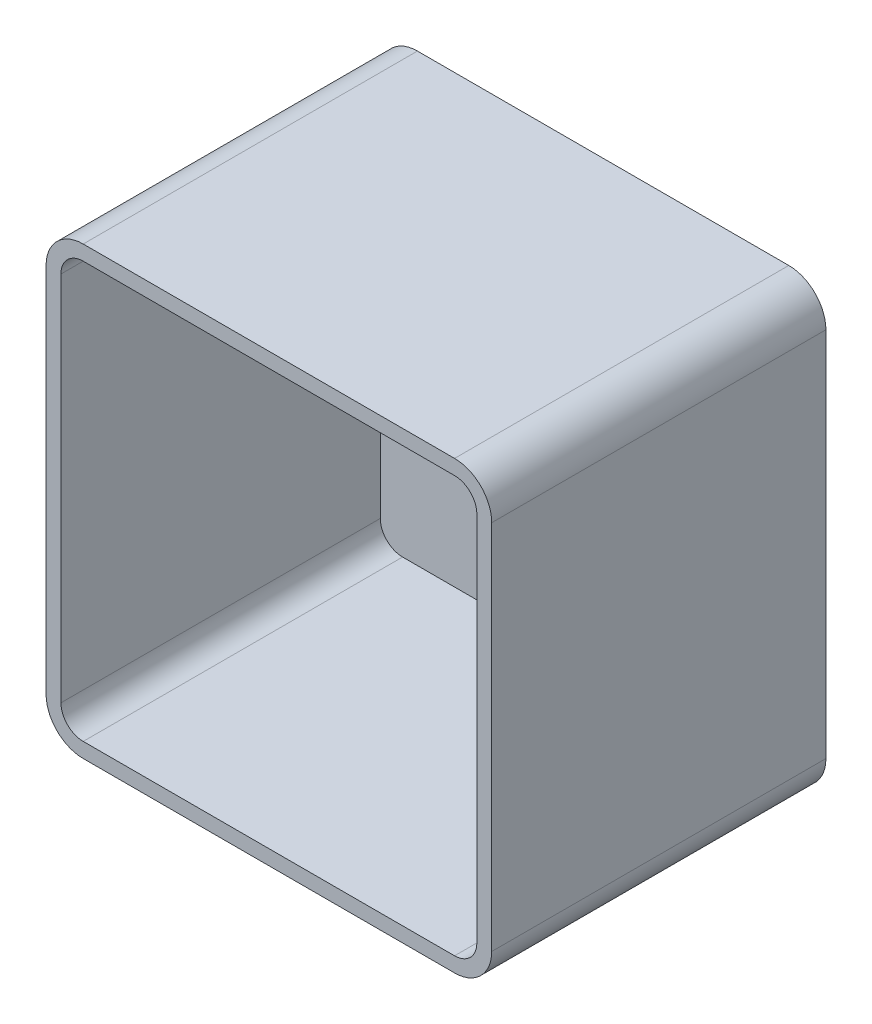
ISO-10303-21;
HEADER;
FILE_DESCRIPTION(('STEP AP214'),'2;1');
FILE_NAME('part.step','',(''),(''),'','','');
FILE_SCHEMA(('AUTOMOTIVE_DESIGN { 1 0 10303 214 1 1 1 1 }'));
ENDSEC;
DATA;
#1=APPLICATION_CONTEXT('core data for automotive mechanical design processes');
#2=APPLICATION_PROTOCOL_DEFINITION('international standard','automotive_design',2000,#1);
#3=PRODUCT_CONTEXT('',#1,'mechanical');
#4=PRODUCT('Part','Part','',(#3));
#5=PRODUCT_RELATED_PRODUCT_CATEGORY('part','',(#4));
#6=PRODUCT_DEFINITION_FORMATION('','',#4);
#7=PRODUCT_DEFINITION_CONTEXT('part definition',#1,'design');
#8=PRODUCT_DEFINITION('design','',#6,#7);
#9=PRODUCT_DEFINITION_SHAPE('','',#8);
#10=(LENGTH_UNIT() NAMED_UNIT(*) SI_UNIT(.MILLI.,.METRE.));
#11=(NAMED_UNIT(*) PLANE_ANGLE_UNIT() SI_UNIT($,.RADIAN.));
#12=(NAMED_UNIT(*) SI_UNIT($,.STERADIAN.) SOLID_ANGLE_UNIT());
#13=UNCERTAINTY_MEASURE_WITH_UNIT(LENGTH_MEASURE(1.E-05),#10,'distance_accuracy_value','');
#14=(GEOMETRIC_REPRESENTATION_CONTEXT(3) GLOBAL_UNCERTAINTY_ASSIGNED_CONTEXT((#13)) GLOBAL_UNIT_ASSIGNED_CONTEXT((#10,
#11,#12)) REPRESENTATION_CONTEXT('',''));
#15=CARTESIAN_POINT('',(0.,0.,0.));
#16=DIRECTION('',(0.,0.,1.));
#17=DIRECTION('',(1.,0.,0.));
#18=AXIS2_PLACEMENT_3D('',#15,#16,#17);
#19=CARTESIAN_POINT('',(-39.9037765875956,25.9718545893403,90.));
#20=DIRECTION('',(1.,0.,0.));
#21=DIRECTION('',(0.,1.,0.));
#22=AXIS2_PLACEMENT_3D('',#19,#20,#21);
#23=PLANE('',#22);
#24=DIRECTION('',(0.,-1.,0.));
#25=VECTOR('',#24,1.);
#26=CARTESIAN_POINT('',(-39.9037765875956,25.9718545893403,0.));
#27=LINE('',#26,#25);
#28=CARTESIAN_POINT('',(-39.9037765875956,15.9718545893403,0.));
#29=VERTEX_POINT('',#28);
#30=CARTESIAN_POINT('',(-39.9037765875956,-84.0281454106597,0.));
#31=VERTEX_POINT('',#30);
#32=EDGE_CURVE('E211',#29,#31,#27,.T.);
#33=ORIENTED_EDGE('',*,*,#32,.T.);
#34=DIRECTION('',(0.,0.,-1.));
#35=VECTOR('',#34,1.);
#36=CARTESIAN_POINT('',(-39.9037765875956,-84.0281454106597,90.));
#37=LINE('',#36,#35);
#38=CARTESIAN_POINT('',(-39.9037765875956,-84.0281454106597,90.));
#39=VERTEX_POINT('',#38);
#40=EDGE_CURVE('E261',#31,#39,#37,.F.);
#41=ORIENTED_EDGE('',*,*,#40,.T.);
#42=DIRECTION('',(0.,-1.,0.));
#43=VECTOR('',#42,1.);
#44=CARTESIAN_POINT('',(-39.9037765875956,25.9718545893403,90.));
#45=LINE('',#44,#43);
#46=CARTESIAN_POINT('',(-39.9037765875956,15.9718545893403,90.));
#47=VERTEX_POINT('',#46);
#48=EDGE_CURVE('E221',#47,#39,#45,.T.);
#49=ORIENTED_EDGE('',*,*,#48,.F.);
#50=DIRECTION('',(0.,0.,-1.));
#51=VECTOR('',#50,1.);
#52=CARTESIAN_POINT('',(-39.9037765875956,15.9718545893403,90.));
#53=LINE('',#52,#51);
#54=EDGE_CURVE('E256',#47,#29,#53,.T.);
#55=ORIENTED_EDGE('',*,*,#54,.T.);
#56=EDGE_LOOP('',(#33,#41,#49,#55));
#57=FACE_BOUND('',#56,.T.);
#58=ADVANCED_FACE('F39',(#57),#23,.F.);
#59=CARTESIAN_POINT('',(-39.9037765875956,-94.0281454106597,90.));
#60=DIRECTION('',(0.,1.,0.));
#61=DIRECTION('',(0.,0.,1.));
#62=AXIS2_PLACEMENT_3D('',#59,#60,#61);
#63=PLANE('',#62);
#64=DIRECTION('',(1.,0.,0.));
#65=VECTOR('',#64,1.);
#66=CARTESIAN_POINT('',(-39.9037765875956,-94.0281454106597,90.));
#67=LINE('',#66,#65);
#68=CARTESIAN_POINT('',(-29.9037765875956,-94.0281454106597,90.));
#69=VERTEX_POINT('',#68);
#70=CARTESIAN_POINT('',(70.0962234124044,-94.0281454106597,90.));
#71=VERTEX_POINT('',#70);
#72=EDGE_CURVE('E226',#69,#71,#67,.T.);
#73=ORIENTED_EDGE('',*,*,#72,.F.);
#74=DIRECTION('',(0.,0.,-1.));
#75=VECTOR('',#74,1.);
#76=CARTESIAN_POINT('',(-29.9037765875956,-94.0281454106597,90.));
#77=LINE('',#76,#75);
#78=CARTESIAN_POINT('',(-29.9037765875956,-94.0281454106597,0.));
#79=VERTEX_POINT('',#78);
#80=EDGE_CURVE('E246',#69,#79,#77,.T.);
#81=ORIENTED_EDGE('',*,*,#80,.T.);
#82=DIRECTION('',(1.,0.,0.));
#83=VECTOR('',#82,1.);
#84=CARTESIAN_POINT('',(-39.9037765875956,-94.0281454106597,0.));
#85=LINE('',#84,#83);
#86=CARTESIAN_POINT('',(70.0962234124044,-94.0281454106597,0.));
#87=VERTEX_POINT('',#86);
#88=EDGE_CURVE('E239',#79,#87,#85,.T.);
#89=ORIENTED_EDGE('',*,*,#88,.T.);
#90=DIRECTION('',(0.,0.,-1.));
#91=VECTOR('',#90,1.);
#92=CARTESIAN_POINT('',(70.0962234124044,-94.0281454106597,90.));
#93=LINE('',#92,#91);
#94=EDGE_CURVE('E237',#87,#71,#93,.F.);
#95=ORIENTED_EDGE('',*,*,#94,.T.);
#96=EDGE_LOOP('',(#73,#81,#89,#95));
#97=FACE_BOUND('',#96,.T.);
#98=ADVANCED_FACE('F304',(#97),#63,.F.);
#99=CARTESIAN_POINT('',(80.0962234124044,25.9718545893403,90.));
#100=DIRECTION('',(-1.,0.,0.));
#101=DIRECTION('',(0.,-1.,0.));
#102=AXIS2_PLACEMENT_3D('',#99,#100,#101);
#103=PLANE('',#102);
#104=DIRECTION('',(0.,1.,0.));
#105=VECTOR('',#104,1.);
#106=CARTESIAN_POINT('',(80.0962234124044,25.9718545893403,90.));
#107=LINE('',#106,#105);
#108=CARTESIAN_POINT('',(80.0962234124044,-84.0281454106597,90.));
#109=VERTEX_POINT('',#108);
#110=CARTESIAN_POINT('',(80.0962234124044,15.9718545893403,90.));
#111=VERTEX_POINT('',#110);
#112=EDGE_CURVE('E233',#109,#111,#107,.T.);
#113=ORIENTED_EDGE('',*,*,#112,.F.);
#114=DIRECTION('',(0.,0.,-1.));
#115=VECTOR('',#114,1.);
#116=CARTESIAN_POINT('',(80.0962234124044,-84.0281454106597,90.));
#117=LINE('',#116,#115);
#118=CARTESIAN_POINT('',(80.0962234124044,-84.0281454106597,0.));
#119=VERTEX_POINT('',#118);
#120=EDGE_CURVE('E272',#109,#119,#117,.T.);
#121=ORIENTED_EDGE('',*,*,#120,.T.);
#122=DIRECTION('',(0.,1.,0.));
#123=VECTOR('',#122,1.);
#124=CARTESIAN_POINT('',(80.0962234124044,25.9718545893403,0.));
#125=LINE('',#124,#123);
#126=CARTESIAN_POINT('',(80.0962234124044,15.9718545893403,0.));
#127=VERTEX_POINT('',#126);
#128=EDGE_CURVE('E241',#119,#127,#125,.T.);
#129=ORIENTED_EDGE('',*,*,#128,.T.);
#130=DIRECTION('',(0.,0.,-1.));
#131=VECTOR('',#130,1.);
#132=CARTESIAN_POINT('',(80.0962234124044,15.9718545893403,90.));
#133=LINE('',#132,#131);
#134=EDGE_CURVE('E271',#127,#111,#133,.F.);
#135=ORIENTED_EDGE('',*,*,#134,.T.);
#136=EDGE_LOOP('',(#113,#121,#129,#135));
#137=FACE_BOUND('',#136,.T.);
#138=ADVANCED_FACE('F310',(#137),#103,.F.);
#139=CARTESIAN_POINT('',(-39.9037765875956,25.9718545893403,90.));
#140=DIRECTION('',(0.,-1.,0.));
#141=DIRECTION('',(0.,0.,-1.));
#142=AXIS2_PLACEMENT_3D('',#139,#140,#141);
#143=PLANE('',#142);
#144=DIRECTION('',(-1.,0.,0.));
#145=VECTOR('',#144,1.);
#146=CARTESIAN_POINT('',(-39.9037765875956,25.9718545893403,0.));
#147=LINE('',#146,#145);
#148=CARTESIAN_POINT('',(70.0962234124044,25.9718545893403,0.));
#149=VERTEX_POINT('',#148);
#150=CARTESIAN_POINT('',(-29.9037765875956,25.9718545893403,0.));
#151=VERTEX_POINT('',#150);
#152=EDGE_CURVE('E230',#149,#151,#147,.T.);
#153=ORIENTED_EDGE('',*,*,#152,.T.);
#154=DIRECTION('',(0.,0.,-1.));
#155=VECTOR('',#154,1.);
#156=CARTESIAN_POINT('',(-29.9037765875956,25.9718545893403,90.));
#157=LINE('',#156,#155);
#158=CARTESIAN_POINT('',(-29.9037765875956,25.9718545893403,90.));
#159=VERTEX_POINT('',#158);
#160=EDGE_CURVE('E11',#151,#159,#157,.F.);
#161=ORIENTED_EDGE('',*,*,#160,.T.);
#162=DIRECTION('',(-1.,0.,0.));
#163=VECTOR('',#162,1.);
#164=CARTESIAN_POINT('',(-39.9037765875956,25.9718545893403,90.));
#165=LINE('',#164,#163);
#166=CARTESIAN_POINT('',(70.0962234124044,25.9718545893403,90.));
#167=VERTEX_POINT('',#166);
#168=EDGE_CURVE('E234',#167,#159,#165,.T.);
#169=ORIENTED_EDGE('',*,*,#168,.F.);
#170=DIRECTION('',(0.,0.,-1.));
#171=VECTOR('',#170,1.);
#172=CARTESIAN_POINT('',(70.0962234124044,25.9718545893403,90.));
#173=LINE('',#172,#171);
#174=EDGE_CURVE('E50',#167,#149,#173,.T.);
#175=ORIENTED_EDGE('',*,*,#174,.T.);
#176=EDGE_LOOP('',(#153,#161,#169,#175));
#177=FACE_BOUND('',#176,.T.);
#178=ADVANCED_FACE('F279',(#177),#143,.F.);
#179=CARTESIAN_POINT('',(0.,0.,90.));
#180=DIRECTION('',(0.,0.,1.));
#181=DIRECTION('',(1.,0.,0.));
#182=AXIS2_PLACEMENT_3D('',#179,#180,#181);
#183=PLANE('',#182);
#184=DIRECTION('',(0.,-1.,0.));
#185=VECTOR('',#184,1.);
#186=CARTESIAN_POINT('',(-35.9037765875956,25.9718545893403,90.));
#187=LINE('',#186,#185);
#188=CARTESIAN_POINT('',(-35.9037765875956,15.9718545893403,90.));
#189=VERTEX_POINT('',#188);
#190=CARTESIAN_POINT('',(-35.9037765875956,-84.0281454106597,90.));
#191=VERTEX_POINT('',#190);
#192=EDGE_CURVE('E179',#189,#191,#187,.T.);
#193=ORIENTED_EDGE('',*,*,#192,.F.);
#194=CARTESIAN_POINT('',(-29.9037765875956,15.9718545893403,90.));
#195=DIRECTION('',(0.,0.,1.));
#196=DIRECTION('',(1.,0.,0.));
#197=AXIS2_PLACEMENT_3D('',#194,#195,#196);
#198=CIRCLE('',#197,6.);
#199=CARTESIAN_POINT('',(-29.9037765875956,21.9718545893403,90.));
#200=VERTEX_POINT('',#199);
#201=EDGE_CURVE('E181',#200,#189,#198,.T.);
#202=ORIENTED_EDGE('',*,*,#201,.F.);
#203=DIRECTION('',(-1.,0.,0.));
#204=VECTOR('',#203,1.);
#205=CARTESIAN_POINT('',(-39.9037765875956,21.9718545893403,90.));
#206=LINE('',#205,#204);
#207=CARTESIAN_POINT('',(70.0962234124044,21.9718545893403,90.));
#208=VERTEX_POINT('',#207);
#209=EDGE_CURVE('E53',#208,#200,#206,.T.);
#210=ORIENTED_EDGE('',*,*,#209,.F.);
#211=CARTESIAN_POINT('',(70.0962234124044,15.9718545893403,90.));
#212=DIRECTION('',(0.,0.,1.));
#213=DIRECTION('',(1.,0.,0.));
#214=AXIS2_PLACEMENT_3D('',#211,#212,#213);
#215=CIRCLE('',#214,6.);
#216=CARTESIAN_POINT('',(76.0962234124044,15.9718545893403,90.));
#217=VERTEX_POINT('',#216);
#218=EDGE_CURVE('E182',#217,#208,#215,.T.);
#219=ORIENTED_EDGE('',*,*,#218,.F.);
#220=DIRECTION('',(0.,1.,0.));
#221=VECTOR('',#220,1.);
#222=CARTESIAN_POINT('',(76.0962234124044,25.9718545893403,90.));
#223=LINE('',#222,#221);
#224=CARTESIAN_POINT('',(76.0962234124044,-84.0281454106597,90.));
#225=VERTEX_POINT('',#224);
#226=EDGE_CURVE('E217',#225,#217,#223,.T.);
#227=ORIENTED_EDGE('',*,*,#226,.F.);
#228=CARTESIAN_POINT('',(70.0962234124044,-84.0281454106597,90.));
#229=DIRECTION('',(0.,0.,1.));
#230=DIRECTION('',(1.,0.,0.));
#231=AXIS2_PLACEMENT_3D('',#228,#229,#230);
#232=CIRCLE('',#231,6.);
#233=CARTESIAN_POINT('',(70.0962234124044,-90.0281454106597,90.));
#234=VERTEX_POINT('',#233);
#235=EDGE_CURVE('E214',#234,#225,#232,.T.);
#236=ORIENTED_EDGE('',*,*,#235,.F.);
#237=DIRECTION('',(1.,0.,0.));
#238=VECTOR('',#237,1.);
#239=CARTESIAN_POINT('',(-39.9037765875956,-90.0281454106597,90.));
#240=LINE('',#239,#238);
#241=CARTESIAN_POINT('',(-29.9037765875956,-90.0281454106597,90.));
#242=VERTEX_POINT('',#241);
#243=EDGE_CURVE('E213',#242,#234,#240,.T.);
#244=ORIENTED_EDGE('',*,*,#243,.F.);
#245=CARTESIAN_POINT('',(-29.9037765875956,-84.0281454106597,90.));
#246=DIRECTION('',(0.,0.,1.));
#247=DIRECTION('',(1.,0.,0.));
#248=AXIS2_PLACEMENT_3D('',#245,#246,#247);
#249=CIRCLE('',#248,6.);
#250=EDGE_CURVE('E206',#191,#242,#249,.T.);
#251=ORIENTED_EDGE('',*,*,#250,.F.);
#252=EDGE_LOOP('',(#193,#202,#210,#219,#227,#236,#244,#251));
#253=FACE_BOUND('',#252,.T.);
#254=ORIENTED_EDGE('',*,*,#48,.T.);
#255=CARTESIAN_POINT('',(-29.9037765875956,-84.0281454106597,90.));
#256=DIRECTION('',(0.,0.,1.));
#257=DIRECTION('',(1.,0.,0.));
#258=AXIS2_PLACEMENT_3D('',#255,#256,#257);
#259=CIRCLE('',#258,10.);
#260=EDGE_CURVE('E267',#39,#69,#259,.T.);
#261=ORIENTED_EDGE('',*,*,#260,.T.);
#262=ORIENTED_EDGE('',*,*,#72,.T.);
#263=CARTESIAN_POINT('',(70.0962234124044,-84.0281454106597,90.));
#264=DIRECTION('',(0.,0.,1.));
#265=DIRECTION('',(1.,0.,0.));
#266=AXIS2_PLACEMENT_3D('',#263,#264,#265);
#267=CIRCLE('',#266,10.);
#268=EDGE_CURVE('E270',#71,#109,#267,.T.);
#269=ORIENTED_EDGE('',*,*,#268,.T.);
#270=ORIENTED_EDGE('',*,*,#112,.T.);
#271=CARTESIAN_POINT('',(70.0962234124044,15.9718545893403,90.));
#272=DIRECTION('',(0.,0.,1.));
#273=DIRECTION('',(1.,0.,0.));
#274=AXIS2_PLACEMENT_3D('',#271,#272,#273);
#275=CIRCLE('',#274,10.);
#276=EDGE_CURVE('E263',#111,#167,#275,.T.);
#277=ORIENTED_EDGE('',*,*,#276,.T.);
#278=ORIENTED_EDGE('',*,*,#168,.T.);
#279=CARTESIAN_POINT('',(-29.9037765875956,15.9718545893403,90.));
#280=DIRECTION('',(0.,0.,1.));
#281=DIRECTION('',(1.,0.,0.));
#282=AXIS2_PLACEMENT_3D('',#279,#280,#281);
#283=CIRCLE('',#282,10.);
#284=EDGE_CURVE('E264',#159,#47,#283,.T.);
#285=ORIENTED_EDGE('',*,*,#284,.T.);
#286=EDGE_LOOP('',(#254,#261,#262,#269,#270,#277,#278,#285));
#287=FACE_BOUND('',#286,.T.);
#288=ADVANCED_FACE('F293',(#253,#287),#183,.T.);
#289=CARTESIAN_POINT('',(0.,0.,0.));
#290=DIRECTION('',(0.,0.,1.));
#291=DIRECTION('',(1.,0.,0.));
#292=AXIS2_PLACEMENT_3D('',#289,#290,#291);
#293=PLANE('',#292);
#294=ORIENTED_EDGE('',*,*,#88,.F.);
#295=CARTESIAN_POINT('',(-29.9037765875956,-84.0281454106597,0.));
#296=DIRECTION('',(0.,0.,1.));
#297=DIRECTION('',(1.,0.,0.));
#298=AXIS2_PLACEMENT_3D('',#295,#296,#297);
#299=CIRCLE('',#298,10.);
#300=EDGE_CURVE('E258',#79,#31,#299,.F.);
#301=ORIENTED_EDGE('',*,*,#300,.T.);
#302=ORIENTED_EDGE('',*,*,#32,.F.);
#303=CARTESIAN_POINT('',(-29.9037765875956,15.9718545893403,0.));
#304=DIRECTION('',(0.,0.,1.));
#305=DIRECTION('',(1.,0.,0.));
#306=AXIS2_PLACEMENT_3D('',#303,#304,#305);
#307=CIRCLE('',#306,10.);
#308=EDGE_CURVE('E252',#29,#151,#307,.F.);
#309=ORIENTED_EDGE('',*,*,#308,.T.);
#310=ORIENTED_EDGE('',*,*,#152,.F.);
#311=CARTESIAN_POINT('',(70.0962234124044,15.9718545893403,0.));
#312=DIRECTION('',(0.,0.,1.));
#313=DIRECTION('',(1.,0.,0.));
#314=AXIS2_PLACEMENT_3D('',#311,#312,#313);
#315=CIRCLE('',#314,10.);
#316=EDGE_CURVE('E247',#149,#127,#315,.F.);
#317=ORIENTED_EDGE('',*,*,#316,.T.);
#318=ORIENTED_EDGE('',*,*,#128,.F.);
#319=CARTESIAN_POINT('',(70.0962234124044,-84.0281454106597,0.));
#320=DIRECTION('',(0.,0.,1.));
#321=DIRECTION('',(1.,0.,0.));
#322=AXIS2_PLACEMENT_3D('',#319,#320,#321);
#323=CIRCLE('',#322,10.);
#324=EDGE_CURVE('E255',#119,#87,#323,.F.);
#325=ORIENTED_EDGE('',*,*,#324,.T.);
#326=EDGE_LOOP('',(#294,#301,#302,#309,#310,#317,#318,#325));
#327=FACE_BOUND('',#326,.T.);
#328=ADVANCED_FACE('F285',(#327),#293,.F.);
#329=CARTESIAN_POINT('',(-29.9037765875956,-84.0281454106597,90.));
#330=DIRECTION('',(0.,0.,-1.));
#331=DIRECTION('',(-1.,0.,0.));
#332=AXIS2_PLACEMENT_3D('',#329,#330,#331);
#333=CYLINDRICAL_SURFACE('',#332,10.);
#334=ORIENTED_EDGE('',*,*,#260,.F.);
#335=ORIENTED_EDGE('',*,*,#40,.F.);
#336=ORIENTED_EDGE('',*,*,#300,.F.);
#337=ORIENTED_EDGE('',*,*,#80,.F.);
#338=EDGE_LOOP('',(#334,#335,#336,#337));
#339=FACE_BOUND('',#338,.T.);
#340=ADVANCED_FACE('F298',(#339),#333,.T.);
#341=CARTESIAN_POINT('',(70.0962234124044,-84.0281454106597,90.));
#342=DIRECTION('',(0.,0.,-1.));
#343=DIRECTION('',(-1.,0.,0.));
#344=AXIS2_PLACEMENT_3D('',#341,#342,#343);
#345=CYLINDRICAL_SURFACE('',#344,10.);
#346=ORIENTED_EDGE('',*,*,#268,.F.);
#347=ORIENTED_EDGE('',*,*,#94,.F.);
#348=ORIENTED_EDGE('',*,*,#324,.F.);
#349=ORIENTED_EDGE('',*,*,#120,.F.);
#350=EDGE_LOOP('',(#346,#347,#348,#349));
#351=FACE_BOUND('',#350,.T.);
#352=ADVANCED_FACE('F308',(#351),#345,.T.);
#353=CARTESIAN_POINT('',(-29.9037765875956,15.9718545893403,90.));
#354=DIRECTION('',(0.,0.,-1.));
#355=DIRECTION('',(-1.,0.,0.));
#356=AXIS2_PLACEMENT_3D('',#353,#354,#355);
#357=CYLINDRICAL_SURFACE('',#356,10.);
#358=ORIENTED_EDGE('',*,*,#284,.F.);
#359=ORIENTED_EDGE('',*,*,#160,.F.);
#360=ORIENTED_EDGE('',*,*,#308,.F.);
#361=ORIENTED_EDGE('',*,*,#54,.F.);
#362=EDGE_LOOP('',(#358,#359,#360,#361));
#363=FACE_BOUND('',#362,.T.);
#364=ADVANCED_FACE('F289',(#363),#357,.T.);
#365=CARTESIAN_POINT('',(70.0962234124044,15.9718545893403,90.));
#366=DIRECTION('',(0.,0.,-1.));
#367=DIRECTION('',(-1.,0.,0.));
#368=AXIS2_PLACEMENT_3D('',#365,#366,#367);
#369=CYLINDRICAL_SURFACE('',#368,10.);
#370=ORIENTED_EDGE('',*,*,#276,.F.);
#371=ORIENTED_EDGE('',*,*,#134,.F.);
#372=ORIENTED_EDGE('',*,*,#316,.F.);
#373=ORIENTED_EDGE('',*,*,#174,.F.);
#374=EDGE_LOOP('',(#370,#371,#372,#373));
#375=FACE_BOUND('',#374,.T.);
#376=ADVANCED_FACE('F41',(#375),#369,.T.);
#377=CARTESIAN_POINT('',(-35.9037765875956,25.9718545893403,90.));
#378=DIRECTION('',(1.,0.,0.));
#379=DIRECTION('',(0.,1.,0.));
#380=AXIS2_PLACEMENT_3D('',#377,#378,#379);
#381=PLANE('',#380);
#382=DIRECTION('',(0.,-1.,0.));
#383=VECTOR('',#382,1.);
#384=CARTESIAN_POINT('',(-35.9037765875956,25.9718545893403,4.));
#385=LINE('',#384,#383);
#386=CARTESIAN_POINT('',(-35.9037765875956,15.9718545893403,4.));
#387=VERTEX_POINT('',#386);
#388=CARTESIAN_POINT('',(-35.9037765875956,-84.0281454106597,4.));
#389=VERTEX_POINT('',#388);
#390=EDGE_CURVE('E169',#387,#389,#385,.T.);
#391=ORIENTED_EDGE('',*,*,#390,.F.);
#392=DIRECTION('',(0.,0.,1.));
#393=VECTOR('',#392,1.);
#394=CARTESIAN_POINT('',(-35.9037765875956,15.9718545893403,90.));
#395=LINE('',#394,#393);
#396=EDGE_CURVE('E163',#189,#387,#395,.F.);
#397=ORIENTED_EDGE('',*,*,#396,.F.);
#398=ORIENTED_EDGE('',*,*,#192,.T.);
#399=DIRECTION('',(0.,0.,1.));
#400=VECTOR('',#399,1.);
#401=CARTESIAN_POINT('',(-35.9037765875956,-84.0281454106597,90.));
#402=LINE('',#401,#400);
#403=EDGE_CURVE('E160',#389,#191,#402,.T.);
#404=ORIENTED_EDGE('',*,*,#403,.F.);
#405=EDGE_LOOP('',(#391,#397,#398,#404));
#406=FACE_BOUND('',#405,.T.);
#407=ADVANCED_FACE('F180',(#406),#381,.T.);
#408=CARTESIAN_POINT('',(-39.9037765875956,-90.0281454106597,90.));
#409=DIRECTION('',(0.,1.,0.));
#410=DIRECTION('',(0.,0.,1.));
#411=AXIS2_PLACEMENT_3D('',#408,#409,#410);
#412=PLANE('',#411);
#413=ORIENTED_EDGE('',*,*,#243,.T.);
#414=DIRECTION('',(0.,0.,1.));
#415=VECTOR('',#414,1.);
#416=CARTESIAN_POINT('',(70.0962234124044,-90.0281454106597,90.));
#417=LINE('',#416,#415);
#418=CARTESIAN_POINT('',(70.0962234124044,-90.0281454106597,4.));
#419=VERTEX_POINT('',#418);
#420=EDGE_CURVE('E196',#419,#234,#417,.T.);
#421=ORIENTED_EDGE('',*,*,#420,.F.);
#422=DIRECTION('',(1.,0.,0.));
#423=VECTOR('',#422,1.);
#424=CARTESIAN_POINT('',(-39.9037765875956,-90.0281454106597,4.));
#425=LINE('',#424,#423);
#426=CARTESIAN_POINT('',(-29.9037765875956,-90.0281454106597,4.));
#427=VERTEX_POINT('',#426);
#428=EDGE_CURVE('E172',#427,#419,#425,.T.);
#429=ORIENTED_EDGE('',*,*,#428,.F.);
#430=DIRECTION('',(0.,0.,1.));
#431=VECTOR('',#430,1.);
#432=CARTESIAN_POINT('',(-29.9037765875956,-90.0281454106597,90.));
#433=LINE('',#432,#431);
#434=EDGE_CURVE('E159',#242,#427,#433,.F.);
#435=ORIENTED_EDGE('',*,*,#434,.F.);
#436=EDGE_LOOP('',(#413,#421,#429,#435));
#437=FACE_BOUND('',#436,.T.);
#438=ADVANCED_FACE('F320',(#437),#412,.T.);
#439=CARTESIAN_POINT('',(76.0962234124044,25.9718545893403,90.));
#440=DIRECTION('',(-1.,0.,0.));
#441=DIRECTION('',(0.,-1.,0.));
#442=AXIS2_PLACEMENT_3D('',#439,#440,#441);
#443=PLANE('',#442);
#444=ORIENTED_EDGE('',*,*,#226,.T.);
#445=DIRECTION('',(0.,0.,1.));
#446=VECTOR('',#445,1.);
#447=CARTESIAN_POINT('',(76.0962234124044,15.9718545893403,90.));
#448=LINE('',#447,#446);
#449=CARTESIAN_POINT('',(76.0962234124044,15.9718545893403,4.));
#450=VERTEX_POINT('',#449);
#451=EDGE_CURVE('E204',#450,#217,#448,.T.);
#452=ORIENTED_EDGE('',*,*,#451,.F.);
#453=DIRECTION('',(0.,1.,0.));
#454=VECTOR('',#453,1.);
#455=CARTESIAN_POINT('',(76.0962234124044,25.9718545893403,4.));
#456=LINE('',#455,#454);
#457=CARTESIAN_POINT('',(76.0962234124044,-84.0281454106597,4.));
#458=VERTEX_POINT('',#457);
#459=EDGE_CURVE('E186',#458,#450,#456,.T.);
#460=ORIENTED_EDGE('',*,*,#459,.F.);
#461=DIRECTION('',(0.,0.,1.));
#462=VECTOR('',#461,1.);
#463=CARTESIAN_POINT('',(76.0962234124044,-84.0281454106597,90.));
#464=LINE('',#463,#462);
#465=EDGE_CURVE('E199',#225,#458,#464,.F.);
#466=ORIENTED_EDGE('',*,*,#465,.F.);
#467=EDGE_LOOP('',(#444,#452,#460,#466));
#468=FACE_BOUND('',#467,.T.);
#469=ADVANCED_FACE('F357',(#468),#443,.T.);
#470=CARTESIAN_POINT('',(-39.9037765875956,21.9718545893403,90.));
#471=DIRECTION('',(0.,-1.,0.));
#472=DIRECTION('',(0.,0.,-1.));
#473=AXIS2_PLACEMENT_3D('',#470,#471,#472);
#474=PLANE('',#473);
#475=DIRECTION('',(-1.,0.,0.));
#476=VECTOR('',#475,1.);
#477=CARTESIAN_POINT('',(-39.9037765875956,21.9718545893403,4.));
#478=LINE('',#477,#476);
#479=CARTESIAN_POINT('',(70.0962234124044,21.9718545893403,4.));
#480=VERTEX_POINT('',#479);
#481=CARTESIAN_POINT('',(-29.9037765875956,21.9718545893403,4.));
#482=VERTEX_POINT('',#481);
#483=EDGE_CURVE('E194',#480,#482,#478,.T.);
#484=ORIENTED_EDGE('',*,*,#483,.F.);
#485=DIRECTION('',(0.,0.,-1.));
#486=VECTOR('',#485,1.);
#487=CARTESIAN_POINT('',(70.0962234124044,21.9718545893403,90.));
#488=LINE('',#487,#486);
#489=EDGE_CURVE('E201',#208,#480,#488,.T.);
#490=ORIENTED_EDGE('',*,*,#489,.F.);
#491=ORIENTED_EDGE('',*,*,#209,.T.);
#492=DIRECTION('',(0.,0.,-1.));
#493=VECTOR('',#492,1.);
#494=CARTESIAN_POINT('',(-29.9037765875956,21.9718545893403,90.));
#495=LINE('',#494,#493);
#496=EDGE_CURVE('E207',#482,#200,#495,.F.);
#497=ORIENTED_EDGE('',*,*,#496,.F.);
#498=EDGE_LOOP('',(#484,#490,#491,#497));
#499=FACE_BOUND('',#498,.T.);
#500=ADVANCED_FACE('F367',(#499),#474,.T.);
#501=CARTESIAN_POINT('',(0.,0.,4.));
#502=DIRECTION('',(0.,0.,1.));
#503=DIRECTION('',(1.,0.,0.));
#504=AXIS2_PLACEMENT_3D('',#501,#502,#503);
#505=PLANE('',#504);
#506=ORIENTED_EDGE('',*,*,#428,.T.);
#507=CARTESIAN_POINT('',(70.0962234124044,-84.0281454106597,4.));
#508=DIRECTION('',(0.,0.,1.));
#509=DIRECTION('',(1.,0.,0.));
#510=AXIS2_PLACEMENT_3D('',#507,#508,#509);
#511=CIRCLE('',#510,6.);
#512=EDGE_CURVE('E164',#458,#419,#511,.F.);
#513=ORIENTED_EDGE('',*,*,#512,.F.);
#514=ORIENTED_EDGE('',*,*,#459,.T.);
#515=CARTESIAN_POINT('',(70.0962234124044,15.9718545893403,4.));
#516=DIRECTION('',(0.,0.,1.));
#517=DIRECTION('',(1.,0.,0.));
#518=AXIS2_PLACEMENT_3D('',#515,#516,#517);
#519=CIRCLE('',#518,6.);
#520=EDGE_CURVE('E187',#480,#450,#519,.F.);
#521=ORIENTED_EDGE('',*,*,#520,.F.);
#522=ORIENTED_EDGE('',*,*,#483,.T.);
#523=CARTESIAN_POINT('',(-29.9037765875956,15.9718545893403,4.));
#524=DIRECTION('',(0.,0.,1.));
#525=DIRECTION('',(1.,0.,0.));
#526=AXIS2_PLACEMENT_3D('',#523,#524,#525);
#527=CIRCLE('',#526,6.);
#528=EDGE_CURVE('E174',#387,#482,#527,.F.);
#529=ORIENTED_EDGE('',*,*,#528,.F.);
#530=ORIENTED_EDGE('',*,*,#390,.T.);
#531=CARTESIAN_POINT('',(-29.9037765875956,-84.0281454106597,4.));
#532=DIRECTION('',(0.,0.,1.));
#533=DIRECTION('',(1.,0.,0.));
#534=AXIS2_PLACEMENT_3D('',#531,#532,#533);
#535=CIRCLE('',#534,6.);
#536=EDGE_CURVE('E153',#427,#389,#535,.F.);
#537=ORIENTED_EDGE('',*,*,#536,.F.);
#538=EDGE_LOOP('',(#506,#513,#514,#521,#522,#529,#530,#537));
#539=FACE_BOUND('',#538,.T.);
#540=ADVANCED_FACE('F166',(#539),#505,.T.);
#541=CARTESIAN_POINT('',(-29.9037765875956,-84.0281454106597,90.));
#542=DIRECTION('',(0.,0.,-1.));
#543=DIRECTION('',(-1.,0.,0.));
#544=AXIS2_PLACEMENT_3D('',#541,#542,#543);
#545=CYLINDRICAL_SURFACE('',#544,6.);
#546=ORIENTED_EDGE('',*,*,#250,.T.);
#547=ORIENTED_EDGE('',*,*,#434,.T.);
#548=ORIENTED_EDGE('',*,*,#536,.T.);
#549=ORIENTED_EDGE('',*,*,#403,.T.);
#550=EDGE_LOOP('',(#546,#547,#548,#549));
#551=FACE_BOUND('',#550,.T.);
#552=ADVANCED_FACE('F154',(#551),#545,.F.);
#553=CARTESIAN_POINT('',(70.0962234124044,-84.0281454106597,90.));
#554=DIRECTION('',(0.,0.,-1.));
#555=DIRECTION('',(-1.,0.,0.));
#556=AXIS2_PLACEMENT_3D('',#553,#554,#555);
#557=CYLINDRICAL_SURFACE('',#556,6.);
#558=ORIENTED_EDGE('',*,*,#235,.T.);
#559=ORIENTED_EDGE('',*,*,#465,.T.);
#560=ORIENTED_EDGE('',*,*,#512,.T.);
#561=ORIENTED_EDGE('',*,*,#420,.T.);
#562=EDGE_LOOP('',(#558,#559,#560,#561));
#563=FACE_BOUND('',#562,.T.);
#564=ADVANCED_FACE('F398',(#563),#557,.F.);
#565=CARTESIAN_POINT('',(-29.9037765875956,15.9718545893403,90.));
#566=DIRECTION('',(0.,0.,-1.));
#567=DIRECTION('',(-1.,0.,0.));
#568=AXIS2_PLACEMENT_3D('',#565,#566,#567);
#569=CYLINDRICAL_SURFACE('',#568,6.);
#570=ORIENTED_EDGE('',*,*,#201,.T.);
#571=ORIENTED_EDGE('',*,*,#396,.T.);
#572=ORIENTED_EDGE('',*,*,#528,.T.);
#573=ORIENTED_EDGE('',*,*,#496,.T.);
#574=EDGE_LOOP('',(#570,#571,#572,#573));
#575=FACE_BOUND('',#574,.T.);
#576=ADVANCED_FACE('F403',(#575),#569,.F.);
#577=CARTESIAN_POINT('',(70.0962234124044,15.9718545893403,90.));
#578=DIRECTION('',(0.,0.,-1.));
#579=DIRECTION('',(-1.,0.,0.));
#580=AXIS2_PLACEMENT_3D('',#577,#578,#579);
#581=CYLINDRICAL_SURFACE('',#580,6.);
#582=ORIENTED_EDGE('',*,*,#218,.T.);
#583=ORIENTED_EDGE('',*,*,#489,.T.);
#584=ORIENTED_EDGE('',*,*,#520,.T.);
#585=ORIENTED_EDGE('',*,*,#451,.T.);
#586=EDGE_LOOP('',(#582,#583,#584,#585));
#587=FACE_BOUND('',#586,.T.);
#588=ADVANCED_FACE('F412',(#587),#581,.F.);
#589=CLOSED_SHELL('',(#58,#98,#138,#178,#288,#328,#340,#352,#364,#376,#407,#438,#469,#500,#540,
#552,#564,#576,#588));
#590=MANIFOLD_SOLID_BREP('B2',#589);
#591=ADVANCED_BREP_SHAPE_REPRESENTATION('',(#18,#590),#14);
#592=SHAPE_DEFINITION_REPRESENTATION(#9,#591);
ENDSEC;
END-ISO-10303-21;
